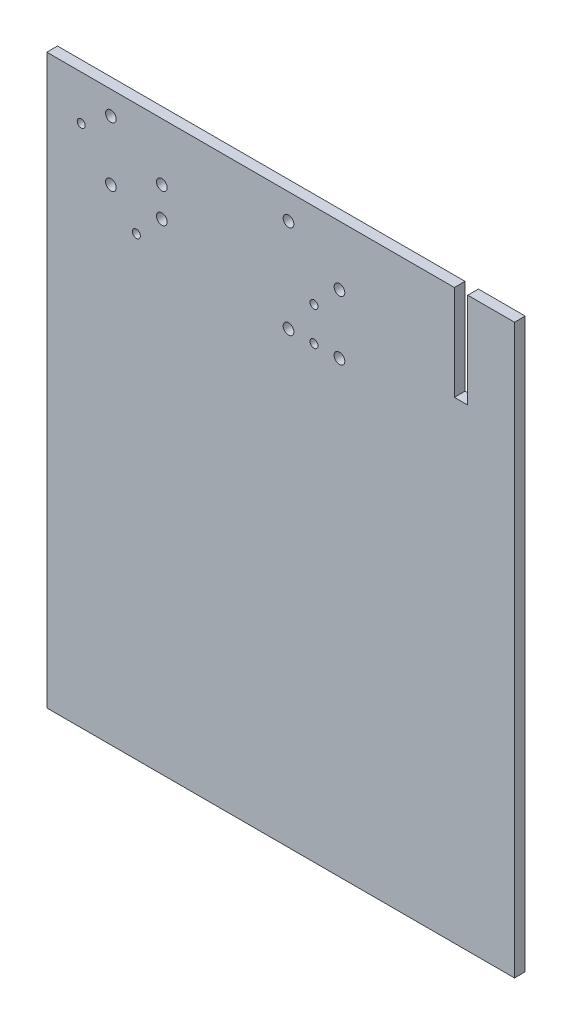
ISO-10303-21;
HEADER;
FILE_DESCRIPTION(('STEP AP214'),'2;1');
FILE_NAME('part.step','',(''),(''),'','','');
FILE_SCHEMA(('AUTOMOTIVE_DESIGN { 1 0 10303 214 1 1 1 1 }'));
ENDSEC;
DATA;
#1=APPLICATION_CONTEXT('core data for automotive mechanical design processes');
#2=APPLICATION_PROTOCOL_DEFINITION('international standard','automotive_design',2000,#1);
#3=PRODUCT_CONTEXT('',#1,'mechanical');
#4=PRODUCT('Part','Part','',(#3));
#5=PRODUCT_RELATED_PRODUCT_CATEGORY('part','',(#4));
#6=PRODUCT_DEFINITION_FORMATION('','',#4);
#7=PRODUCT_DEFINITION_CONTEXT('part definition',#1,'design');
#8=PRODUCT_DEFINITION('design','',#6,#7);
#9=PRODUCT_DEFINITION_SHAPE('','',#8);
#10=(LENGTH_UNIT() NAMED_UNIT(*) SI_UNIT(.MILLI.,.METRE.));
#11=(NAMED_UNIT(*) PLANE_ANGLE_UNIT() SI_UNIT($,.RADIAN.));
#12=(NAMED_UNIT(*) SI_UNIT($,.STERADIAN.) SOLID_ANGLE_UNIT());
#13=UNCERTAINTY_MEASURE_WITH_UNIT(LENGTH_MEASURE(1.E-05),#10,'distance_accuracy_value','');
#14=(GEOMETRIC_REPRESENTATION_CONTEXT(3) GLOBAL_UNCERTAINTY_ASSIGNED_CONTEXT((#13)) GLOBAL_UNIT_ASSIGNED_CONTEXT((#10,
#11,#12)) REPRESENTATION_CONTEXT('',''));
#15=CARTESIAN_POINT('',(0.,0.,0.));
#16=DIRECTION('',(0.,0.,1.));
#17=DIRECTION('',(1.,0.,0.));
#18=AXIS2_PLACEMENT_3D('',#15,#16,#17);
#19=CARTESIAN_POINT('',(28.,42.5,1.6));
#20=DIRECTION('',(0.,-1.,0.));
#21=DIRECTION('',(0.,0.,-1.));
#22=AXIS2_PLACEMENT_3D('',#19,#20,#21);
#23=PLANE('',#22);
#24=DIRECTION('',(-1.,0.,0.));
#25=VECTOR('',#24,1.);
#26=CARTESIAN_POINT('',(28.,42.5,0.));
#27=LINE('',#26,#25);
#28=CARTESIAN_POINT('',(35.,42.5,0.));
#29=VERTEX_POINT('',#28);
#30=CARTESIAN_POINT('',(28.,42.5,0.));
#31=VERTEX_POINT('',#30);
#32=EDGE_CURVE('E142',#29,#31,#27,.T.);
#33=ORIENTED_EDGE('',*,*,#32,.T.);
#34=DIRECTION('',(0.,0.,-1.));
#35=VECTOR('',#34,1.);
#36=CARTESIAN_POINT('',(28.,42.5,1.6));
#37=LINE('',#36,#35);
#38=CARTESIAN_POINT('',(28.,42.5,1.6));
#39=VERTEX_POINT('',#38);
#40=EDGE_CURVE('E11',#39,#31,#37,.T.);
#41=ORIENTED_EDGE('',*,*,#40,.F.);
#42=DIRECTION('',(-1.,0.,0.));
#43=VECTOR('',#42,1.);
#44=CARTESIAN_POINT('',(28.,42.5,1.6));
#45=LINE('',#44,#43);
#46=CARTESIAN_POINT('',(35.,42.5,1.6));
#47=VERTEX_POINT('',#46);
#48=EDGE_CURVE('E165',#47,#39,#45,.T.);
#49=ORIENTED_EDGE('',*,*,#48,.F.);
#50=DIRECTION('',(0.,0.,-1.));
#51=VECTOR('',#50,1.);
#52=CARTESIAN_POINT('',(35.,42.5,1.6));
#53=LINE('',#52,#51);
#54=EDGE_CURVE('E138',#47,#29,#53,.T.);
#55=ORIENTED_EDGE('',*,*,#54,.T.);
#56=EDGE_LOOP('',(#33,#41,#49,#55));
#57=FACE_BOUND('',#56,.T.);
#58=ADVANCED_FACE('F41',(#57),#23,.F.);
#59=CARTESIAN_POINT('',(28.,42.5,1.6));
#60=DIRECTION('',(1.,0.,0.));
#61=DIRECTION('',(0.,1.,0.));
#62=AXIS2_PLACEMENT_3D('',#59,#60,#61);
#63=PLANE('',#62);
#64=DIRECTION('',(0.,-1.,0.));
#65=VECTOR('',#64,1.);
#66=CARTESIAN_POINT('',(28.,42.5,0.));
#67=LINE('',#66,#65);
#68=CARTESIAN_POINT('',(28.,28.26,0.));
#69=VERTEX_POINT('',#68);
#70=EDGE_CURVE('E146',#31,#69,#67,.T.);
#71=ORIENTED_EDGE('',*,*,#70,.T.);
#72=DIRECTION('',(0.,0.,-1.));
#73=VECTOR('',#72,1.);
#74=CARTESIAN_POINT('',(28.,28.26,1.6));
#75=LINE('',#74,#73);
#76=CARTESIAN_POINT('',(28.,28.26,1.6));
#77=VERTEX_POINT('',#76);
#78=EDGE_CURVE('E50',#77,#69,#75,.T.);
#79=ORIENTED_EDGE('',*,*,#78,.F.);
#80=DIRECTION('',(0.,-1.,0.));
#81=VECTOR('',#80,1.);
#82=CARTESIAN_POINT('',(28.,42.5,1.6));
#83=LINE('',#82,#81);
#84=EDGE_CURVE('E101',#39,#77,#83,.T.);
#85=ORIENTED_EDGE('',*,*,#84,.F.);
#86=ORIENTED_EDGE('',*,*,#40,.T.);
#87=EDGE_LOOP('',(#71,#79,#85,#86));
#88=FACE_BOUND('',#87,.T.);
#89=ADVANCED_FACE('F342',(#88),#63,.F.);
#90=CARTESIAN_POINT('',(28.,28.26,1.6));
#91=DIRECTION('',(0.,-1.,0.));
#92=DIRECTION('',(1.,0.,0.));
#93=AXIS2_PLACEMENT_3D('',#90,#91,#92);
#94=PLANE('',#93);
#95=DIRECTION('',(-1.,0.,0.));
#96=VECTOR('',#95,1.);
#97=CARTESIAN_POINT('',(28.,28.26,0.));
#98=LINE('',#97,#96);
#99=CARTESIAN_POINT('',(26.,28.26,0.));
#100=VERTEX_POINT('',#99);
#101=EDGE_CURVE('E150',#69,#100,#98,.T.);
#102=ORIENTED_EDGE('',*,*,#101,.T.);
#103=DIRECTION('',(0.,0.,-1.));
#104=VECTOR('',#103,1.);
#105=CARTESIAN_POINT('',(26.,28.26,1.6));
#106=LINE('',#105,#104);
#107=CARTESIAN_POINT('',(26.,28.26,1.6));
#108=VERTEX_POINT('',#107);
#109=EDGE_CURVE('E176',#108,#100,#106,.T.);
#110=ORIENTED_EDGE('',*,*,#109,.F.);
#111=DIRECTION('',(-1.,0.,0.));
#112=VECTOR('',#111,1.);
#113=CARTESIAN_POINT('',(28.,28.26,1.6));
#114=LINE('',#113,#112);
#115=EDGE_CURVE('E186',#77,#108,#114,.T.);
#116=ORIENTED_EDGE('',*,*,#115,.F.);
#117=ORIENTED_EDGE('',*,*,#78,.T.);
#118=EDGE_LOOP('',(#102,#110,#116,#117));
#119=FACE_BOUND('',#118,.T.);
#120=ADVANCED_FACE('F184',(#119),#94,.F.);
#121=CARTESIAN_POINT('',(26.,28.26,1.6));
#122=DIRECTION('',(-1.,0.,0.));
#123=DIRECTION('',(0.,0.,1.));
#124=AXIS2_PLACEMENT_3D('',#121,#122,#123);
#125=PLANE('',#124);
#126=DIRECTION('',(0.,1.,0.));
#127=VECTOR('',#126,1.);
#128=CARTESIAN_POINT('',(26.,28.26,0.));
#129=LINE('',#128,#127);
#130=CARTESIAN_POINT('',(26.,42.5,0.));
#131=VERTEX_POINT('',#130);
#132=EDGE_CURVE('E153',#100,#131,#129,.T.);
#133=ORIENTED_EDGE('',*,*,#132,.T.);
#134=DIRECTION('',(0.,0.,-1.));
#135=VECTOR('',#134,1.);
#136=CARTESIAN_POINT('',(26.,42.5,1.6));
#137=LINE('',#136,#135);
#138=CARTESIAN_POINT('',(26.,42.5,1.6));
#139=VERTEX_POINT('',#138);
#140=EDGE_CURVE('E172',#139,#131,#137,.T.);
#141=ORIENTED_EDGE('',*,*,#140,.F.);
#142=DIRECTION('',(0.,1.,0.));
#143=VECTOR('',#142,1.);
#144=CARTESIAN_POINT('',(26.,28.26,1.6));
#145=LINE('',#144,#143);
#146=EDGE_CURVE('E199',#108,#139,#145,.T.);
#147=ORIENTED_EDGE('',*,*,#146,.F.);
#148=ORIENTED_EDGE('',*,*,#109,.T.);
#149=EDGE_LOOP('',(#133,#141,#147,#148));
#150=FACE_BOUND('',#149,.T.);
#151=ADVANCED_FACE('F194',(#150),#125,.F.);
#152=CARTESIAN_POINT('',(-35.,42.5,1.6));
#153=DIRECTION('',(0.,-1.,0.));
#154=DIRECTION('',(0.,0.,-1.));
#155=AXIS2_PLACEMENT_3D('',#152,#153,#154);
#156=PLANE('',#155);
#157=DIRECTION('',(-1.,0.,0.));
#158=VECTOR('',#157,1.);
#159=CARTESIAN_POINT('',(-35.,42.5,0.));
#160=LINE('',#159,#158);
#161=CARTESIAN_POINT('',(-35.,42.5,0.));
#162=VERTEX_POINT('',#161);
#163=EDGE_CURVE('E156',#131,#162,#160,.T.);
#164=ORIENTED_EDGE('',*,*,#163,.T.);
#165=DIRECTION('',(0.,0.,-1.));
#166=VECTOR('',#165,1.);
#167=CARTESIAN_POINT('',(-35.,42.5,1.6));
#168=LINE('',#167,#166);
#169=CARTESIAN_POINT('',(-35.,42.5,1.6));
#170=VERTEX_POINT('',#169);
#171=EDGE_CURVE('E131',#170,#162,#168,.T.);
#172=ORIENTED_EDGE('',*,*,#171,.F.);
#173=DIRECTION('',(-1.,0.,0.));
#174=VECTOR('',#173,1.);
#175=CARTESIAN_POINT('',(-35.,42.5,1.6));
#176=LINE('',#175,#174);
#177=EDGE_CURVE('E120',#139,#170,#176,.T.);
#178=ORIENTED_EDGE('',*,*,#177,.F.);
#179=ORIENTED_EDGE('',*,*,#140,.T.);
#180=EDGE_LOOP('',(#164,#172,#178,#179));
#181=FACE_BOUND('',#180,.T.);
#182=ADVANCED_FACE('F197',(#181),#156,.F.);
#183=CARTESIAN_POINT('',(-35.,-42.5,1.6));
#184=DIRECTION('',(1.,0.,0.));
#185=DIRECTION('',(0.,0.,-1.));
#186=AXIS2_PLACEMENT_3D('',#183,#184,#185);
#187=PLANE('',#186);
#188=DIRECTION('',(0.,-1.,0.));
#189=VECTOR('',#188,1.);
#190=CARTESIAN_POINT('',(-35.,-42.5,0.));
#191=LINE('',#190,#189);
#192=CARTESIAN_POINT('',(-35.,-42.5,0.));
#193=VERTEX_POINT('',#192);
#194=EDGE_CURVE('E129',#162,#193,#191,.T.);
#195=ORIENTED_EDGE('',*,*,#194,.T.);
#196=DIRECTION('',(0.,0.,-1.));
#197=VECTOR('',#196,1.);
#198=CARTESIAN_POINT('',(-35.,-42.5,1.6));
#199=LINE('',#198,#197);
#200=CARTESIAN_POINT('',(-35.,-42.5,1.6));
#201=VERTEX_POINT('',#200);
#202=EDGE_CURVE('E126',#201,#193,#199,.T.);
#203=ORIENTED_EDGE('',*,*,#202,.F.);
#204=DIRECTION('',(0.,-1.,0.));
#205=VECTOR('',#204,1.);
#206=CARTESIAN_POINT('',(-35.,-42.5,1.6));
#207=LINE('',#206,#205);
#208=EDGE_CURVE('E114',#170,#201,#207,.T.);
#209=ORIENTED_EDGE('',*,*,#208,.F.);
#210=ORIENTED_EDGE('',*,*,#171,.T.);
#211=EDGE_LOOP('',(#195,#203,#209,#210));
#212=FACE_BOUND('',#211,.T.);
#213=ADVANCED_FACE('F127',(#212),#187,.F.);
#214=CARTESIAN_POINT('',(-35.,-42.5,1.6));
#215=DIRECTION('',(0.,1.,0.));
#216=DIRECTION('',(0.,0.,1.));
#217=AXIS2_PLACEMENT_3D('',#214,#215,#216);
#218=PLANE('',#217);
#219=DIRECTION('',(1.,0.,0.));
#220=VECTOR('',#219,1.);
#221=CARTESIAN_POINT('',(-35.,-42.5,0.));
#222=LINE('',#221,#220);
#223=CARTESIAN_POINT('',(35.,-42.5,0.));
#224=VERTEX_POINT('',#223);
#225=EDGE_CURVE('E87',#193,#224,#222,.T.);
#226=ORIENTED_EDGE('',*,*,#225,.T.);
#227=DIRECTION('',(0.,0.,-1.));
#228=VECTOR('',#227,1.);
#229=CARTESIAN_POINT('',(35.,-42.5,1.6));
#230=LINE('',#229,#228);
#231=CARTESIAN_POINT('',(35.,-42.5,1.6));
#232=VERTEX_POINT('',#231);
#233=EDGE_CURVE('E132',#232,#224,#230,.T.);
#234=ORIENTED_EDGE('',*,*,#233,.F.);
#235=DIRECTION('',(1.,0.,0.));
#236=VECTOR('',#235,1.);
#237=CARTESIAN_POINT('',(-35.,-42.5,1.6));
#238=LINE('',#237,#236);
#239=EDGE_CURVE('E118',#201,#232,#238,.T.);
#240=ORIENTED_EDGE('',*,*,#239,.F.);
#241=ORIENTED_EDGE('',*,*,#202,.T.);
#242=EDGE_LOOP('',(#226,#234,#240,#241));
#243=FACE_BOUND('',#242,.T.);
#244=ADVANCED_FACE('F134',(#243),#218,.F.);
#245=CARTESIAN_POINT('',(35.,-42.5,1.6));
#246=DIRECTION('',(-1.,0.,0.));
#247=DIRECTION('',(0.,0.,1.));
#248=AXIS2_PLACEMENT_3D('',#245,#246,#247);
#249=PLANE('',#248);
#250=DIRECTION('',(0.,1.,0.));
#251=VECTOR('',#250,1.);
#252=CARTESIAN_POINT('',(35.,-42.5,0.));
#253=LINE('',#252,#251);
#254=EDGE_CURVE('E93',#224,#29,#253,.T.);
#255=ORIENTED_EDGE('',*,*,#254,.T.);
#256=ORIENTED_EDGE('',*,*,#54,.F.);
#257=DIRECTION('',(0.,1.,0.));
#258=VECTOR('',#257,1.);
#259=CARTESIAN_POINT('',(35.,-42.5,1.6));
#260=LINE('',#259,#258);
#261=EDGE_CURVE('E58',#232,#47,#260,.T.);
#262=ORIENTED_EDGE('',*,*,#261,.F.);
#263=ORIENTED_EDGE('',*,*,#233,.T.);
#264=EDGE_LOOP('',(#255,#256,#262,#263));
#265=FACE_BOUND('',#264,.T.);
#266=ADVANCED_FACE('F317',(#265),#249,.F.);
#267=CARTESIAN_POINT('',(0.,0.,1.6));
#268=DIRECTION('',(0.,0.,1.));
#269=DIRECTION('',(1.,0.,0.));
#270=AXIS2_PLACEMENT_3D('',#267,#268,#269);
#271=PLANE('',#270);
#272=CARTESIAN_POINT('',(-29.8453411553624,35.8394967738393,1.6));
#273=DIRECTION('',(0.,0.,1.));
#274=DIRECTION('',(1.,0.,0.));
#275=AXIS2_PLACEMENT_3D('',#272,#273,#274);
#276=CIRCLE('',#275,0.600000000000001);
#277=CARTESIAN_POINT('',(-29.2453411553624,35.8394967738393,1.6));
#278=VERTEX_POINT('',#277);
#279=EDGE_CURVE('E258',#278,#278,#276,.T.);
#280=ORIENTED_EDGE('',*,*,#279,.F.);
#281=EDGE_LOOP('',(#280));
#282=FACE_BOUND('',#281,.T.);
#283=CARTESIAN_POINT('',(4.98804487002071,24.7194139512987,1.6));
#284=DIRECTION('',(0.,0.,1.));
#285=DIRECTION('',(1.,0.,0.));
#286=AXIS2_PLACEMENT_3D('',#283,#284,#285);
#287=CIRCLE('',#286,0.6);
#288=CARTESIAN_POINT('',(5.58804487002071,24.7194139512987,1.6));
#289=VERTEX_POINT('',#288);
#290=EDGE_CURVE('E249',#289,#289,#287,.T.);
#291=ORIENTED_EDGE('',*,*,#290,.F.);
#292=EDGE_LOOP('',(#291));
#293=FACE_BOUND('',#292,.T.);
#294=CARTESIAN_POINT('',(8.79804487002071,24.7194139512987,1.6));
#295=DIRECTION('',(0.,0.,1.));
#296=DIRECTION('',(1.,0.,0.));
#297=AXIS2_PLACEMENT_3D('',#294,#295,#296);
#298=CIRCLE('',#297,0.8);
#299=CARTESIAN_POINT('',(9.59804487002071,24.7194139512987,1.6));
#300=VERTEX_POINT('',#299);
#301=EDGE_CURVE('E274',#300,#300,#298,.T.);
#302=ORIENTED_EDGE('',*,*,#301,.F.);
#303=EDGE_LOOP('',(#302));
#304=FACE_BOUND('',#303,.T.);
#305=CARTESIAN_POINT('',(1.17804487002071,24.7194139512987,1.6));
#306=DIRECTION('',(0.,0.,1.));
#307=DIRECTION('',(1.,0.,0.));
#308=AXIS2_PLACEMENT_3D('',#305,#306,#307);
#309=CIRCLE('',#308,0.799999999999999);
#310=CARTESIAN_POINT('',(1.97804487002071,24.7194139512987,1.6));
#311=VERTEX_POINT('',#310);
#312=EDGE_CURVE('E265',#311,#311,#309,.T.);
#313=ORIENTED_EDGE('',*,*,#312,.F.);
#314=EDGE_LOOP('',(#313));
#315=FACE_BOUND('',#314,.T.);
#316=CARTESIAN_POINT('',(-25.4053411553624,39.0094967738393,1.6));
#317=DIRECTION('',(0.,0.,1.));
#318=DIRECTION('',(1.,0.,0.));
#319=AXIS2_PLACEMENT_3D('',#316,#317,#318);
#320=CIRCLE('',#319,0.8);
#321=CARTESIAN_POINT('',(-24.6053411553624,39.0094967738393,1.6));
#322=VERTEX_POINT('',#321);
#323=EDGE_CURVE('E217',#322,#322,#320,.T.);
#324=ORIENTED_EDGE('',*,*,#323,.F.);
#325=EDGE_LOOP('',(#324));
#326=FACE_BOUND('',#325,.T.);
#327=CARTESIAN_POINT('',(-17.7853411553624,33.9294967738393,1.6));
#328=DIRECTION('',(0.,0.,1.));
#329=DIRECTION('',(1.,0.,0.));
#330=AXIS2_PLACEMENT_3D('',#327,#328,#329);
#331=CIRCLE('',#330,0.8);
#332=CARTESIAN_POINT('',(-16.9853411553624,33.9294967738393,1.6));
#333=VERTEX_POINT('',#332);
#334=EDGE_CURVE('E226',#333,#333,#331,.T.);
#335=ORIENTED_EDGE('',*,*,#334,.F.);
#336=EDGE_LOOP('',(#335));
#337=FACE_BOUND('',#336,.T.);
#338=CARTESIAN_POINT('',(-25.4053411553624,30.1194967738393,1.6));
#339=DIRECTION('',(0.,0.,1.));
#340=DIRECTION('',(1.,0.,0.));
#341=AXIS2_PLACEMENT_3D('',#338,#339,#340);
#342=CIRCLE('',#341,0.799999999999999);
#343=CARTESIAN_POINT('',(-24.6053411553624,30.1194967738393,1.6));
#344=VERTEX_POINT('',#343);
#345=EDGE_CURVE('E234',#344,#344,#342,.T.);
#346=ORIENTED_EDGE('',*,*,#345,.F.);
#347=EDGE_LOOP('',(#346));
#348=FACE_BOUND('',#347,.T.);
#349=CARTESIAN_POINT('',(-17.7853411553624,29.4844967738393,1.6));
#350=DIRECTION('',(0.,0.,1.));
#351=DIRECTION('',(1.,0.,0.));
#352=AXIS2_PLACEMENT_3D('',#349,#350,#351);
#353=CIRCLE('',#352,0.799999999999999);
#354=CARTESIAN_POINT('',(-16.9853411553624,29.4844967738393,1.6));
#355=VERTEX_POINT('',#354);
#356=EDGE_CURVE('E242',#355,#355,#353,.T.);
#357=ORIENTED_EDGE('',*,*,#356,.F.);
#358=EDGE_LOOP('',(#357));
#359=FACE_BOUND('',#358,.T.);
#360=CARTESIAN_POINT('',(4.98804487002071,29.7994139512987,1.6));
#361=DIRECTION('',(0.,0.,1.));
#362=DIRECTION('',(1.,0.,0.));
#363=AXIS2_PLACEMENT_3D('',#360,#361,#362);
#364=CIRCLE('',#363,0.6);
#365=CARTESIAN_POINT('',(5.58804487002071,29.7994139512987,1.6));
#366=VERTEX_POINT('',#365);
#367=EDGE_CURVE('E297',#366,#366,#364,.T.);
#368=ORIENTED_EDGE('',*,*,#367,.F.);
#369=EDGE_LOOP('',(#368));
#370=FACE_BOUND('',#369,.T.);
#371=CARTESIAN_POINT('',(8.79804487002071,33.6094139512987,1.6));
#372=DIRECTION('',(0.,0.,1.));
#373=DIRECTION('',(1.,0.,0.));
#374=AXIS2_PLACEMENT_3D('',#371,#372,#373);
#375=CIRCLE('',#374,0.800000000000003);
#376=CARTESIAN_POINT('',(9.59804487002071,33.6094139512987,1.6));
#377=VERTEX_POINT('',#376);
#378=EDGE_CURVE('E289',#377,#377,#375,.T.);
#379=ORIENTED_EDGE('',*,*,#378,.F.);
#380=EDGE_LOOP('',(#379));
#381=FACE_BOUND('',#380,.T.);
#382=CARTESIAN_POINT('',(1.17804487002071,38.6894139512987,1.6));
#383=DIRECTION('',(0.,0.,1.));
#384=DIRECTION('',(1.,0.,0.));
#385=AXIS2_PLACEMENT_3D('',#382,#383,#384);
#386=CIRCLE('',#385,0.800000000000001);
#387=CARTESIAN_POINT('',(1.97804487002071,38.6894139512987,1.6));
#388=VERTEX_POINT('',#387);
#389=EDGE_CURVE('E281',#388,#388,#386,.T.);
#390=ORIENTED_EDGE('',*,*,#389,.F.);
#391=EDGE_LOOP('',(#390));
#392=FACE_BOUND('',#391,.T.);
#393=CARTESIAN_POINT('',(-21.5953411553624,25.6694967738393,1.6));
#394=DIRECTION('',(0.,0.,1.));
#395=DIRECTION('',(1.,0.,0.));
#396=AXIS2_PLACEMENT_3D('',#393,#394,#395);
#397=CIRCLE('',#396,0.6);
#398=CARTESIAN_POINT('',(-20.9953411553624,25.6694967738393,1.6));
#399=VERTEX_POINT('',#398);
#400=EDGE_CURVE('E209',#399,#399,#397,.T.);
#401=ORIENTED_EDGE('',*,*,#400,.F.);
#402=EDGE_LOOP('',(#401));
#403=FACE_BOUND('',#402,.T.);
#404=ORIENTED_EDGE('',*,*,#48,.T.);
#405=ORIENTED_EDGE('',*,*,#84,.T.);
#406=ORIENTED_EDGE('',*,*,#115,.T.);
#407=ORIENTED_EDGE('',*,*,#146,.T.);
#408=ORIENTED_EDGE('',*,*,#177,.T.);
#409=ORIENTED_EDGE('',*,*,#208,.T.);
#410=ORIENTED_EDGE('',*,*,#239,.T.);
#411=ORIENTED_EDGE('',*,*,#261,.T.);
#412=EDGE_LOOP('',(#404,#405,#406,#407,#408,#409,#410,#411));
#413=FACE_BOUND('',#412,.T.);
#414=ADVANCED_FACE('F116',(#282,#293,#304,#315,#326,#337,#348,#359,#370,#381,#392,#403,#413),
#271,.T.);
#415=CARTESIAN_POINT('',(0.,0.,0.));
#416=DIRECTION('',(0.,0.,1.));
#417=DIRECTION('',(1.,0.,0.));
#418=AXIS2_PLACEMENT_3D('',#415,#416,#417);
#419=PLANE('',#418);
#420=CARTESIAN_POINT('',(-29.8453411553624,35.8394967738393,0.));
#421=DIRECTION('',(0.,0.,1.));
#422=DIRECTION('',(1.,0.,0.));
#423=AXIS2_PLACEMENT_3D('',#420,#421,#422);
#424=CIRCLE('',#423,0.600000000000001);
#425=CARTESIAN_POINT('',(-29.2453411553624,35.8394967738393,0.));
#426=VERTEX_POINT('',#425);
#427=EDGE_CURVE('E222',#426,#426,#424,.T.);
#428=ORIENTED_EDGE('',*,*,#427,.T.);
#429=EDGE_LOOP('',(#428));
#430=FACE_BOUND('',#429,.T.);
#431=CARTESIAN_POINT('',(4.98804487002071,24.7194139512987,0.));
#432=DIRECTION('',(0.,0.,1.));
#433=DIRECTION('',(1.,0.,0.));
#434=AXIS2_PLACEMENT_3D('',#431,#432,#433);
#435=CIRCLE('',#434,0.6);
#436=CARTESIAN_POINT('',(5.58804487002071,24.7194139512987,0.));
#437=VERTEX_POINT('',#436);
#438=EDGE_CURVE('E253',#437,#437,#435,.T.);
#439=ORIENTED_EDGE('',*,*,#438,.T.);
#440=EDGE_LOOP('',(#439));
#441=FACE_BOUND('',#440,.T.);
#442=CARTESIAN_POINT('',(8.79804487002071,24.7194139512987,0.));
#443=DIRECTION('',(0.,0.,1.));
#444=DIRECTION('',(1.,0.,0.));
#445=AXIS2_PLACEMENT_3D('',#442,#443,#444);
#446=CIRCLE('',#445,0.8);
#447=CARTESIAN_POINT('',(9.59804487002071,24.7194139512987,0.));
#448=VERTEX_POINT('',#447);
#449=EDGE_CURVE('E254',#448,#448,#446,.T.);
#450=ORIENTED_EDGE('',*,*,#449,.T.);
#451=EDGE_LOOP('',(#450));
#452=FACE_BOUND('',#451,.T.);
#453=CARTESIAN_POINT('',(1.17804487002071,24.7194139512987,0.));
#454=DIRECTION('',(0.,0.,1.));
#455=DIRECTION('',(1.,0.,0.));
#456=AXIS2_PLACEMENT_3D('',#453,#454,#455);
#457=CIRCLE('',#456,0.799999999999999);
#458=CARTESIAN_POINT('',(1.97804487002071,24.7194139512987,0.));
#459=VERTEX_POINT('',#458);
#460=EDGE_CURVE('E269',#459,#459,#457,.T.);
#461=ORIENTED_EDGE('',*,*,#460,.T.);
#462=EDGE_LOOP('',(#461));
#463=FACE_BOUND('',#462,.T.);
#464=CARTESIAN_POINT('',(-25.4053411553624,39.0094967738393,0.));
#465=DIRECTION('',(0.,0.,1.));
#466=DIRECTION('',(1.,0.,0.));
#467=AXIS2_PLACEMENT_3D('',#464,#465,#466);
#468=CIRCLE('',#467,0.8);
#469=CARTESIAN_POINT('',(-24.6053411553624,39.0094967738393,0.));
#470=VERTEX_POINT('',#469);
#471=EDGE_CURVE('E221',#470,#470,#468,.T.);
#472=ORIENTED_EDGE('',*,*,#471,.T.);
#473=EDGE_LOOP('',(#472));
#474=FACE_BOUND('',#473,.T.);
#475=CARTESIAN_POINT('',(-17.7853411553624,33.9294967738393,0.));
#476=DIRECTION('',(0.,0.,1.));
#477=DIRECTION('',(1.,0.,0.));
#478=AXIS2_PLACEMENT_3D('',#475,#476,#477);
#479=CIRCLE('',#478,0.8);
#480=CARTESIAN_POINT('',(-16.9853411553624,33.9294967738393,0.));
#481=VERTEX_POINT('',#480);
#482=EDGE_CURVE('E230',#481,#481,#479,.T.);
#483=ORIENTED_EDGE('',*,*,#482,.T.);
#484=EDGE_LOOP('',(#483));
#485=FACE_BOUND('',#484,.T.);
#486=CARTESIAN_POINT('',(-25.4053411553624,30.1194967738393,0.));
#487=DIRECTION('',(0.,0.,1.));
#488=DIRECTION('',(1.,0.,0.));
#489=AXIS2_PLACEMENT_3D('',#486,#487,#488);
#490=CIRCLE('',#489,0.799999999999999);
#491=CARTESIAN_POINT('',(-24.6053411553624,30.1194967738393,0.));
#492=VERTEX_POINT('',#491);
#493=EDGE_CURVE('E238',#492,#492,#490,.T.);
#494=ORIENTED_EDGE('',*,*,#493,.T.);
#495=EDGE_LOOP('',(#494));
#496=FACE_BOUND('',#495,.T.);
#497=CARTESIAN_POINT('',(-17.7853411553624,29.4844967738393,0.));
#498=DIRECTION('',(0.,0.,1.));
#499=DIRECTION('',(1.,0.,0.));
#500=AXIS2_PLACEMENT_3D('',#497,#498,#499);
#501=CIRCLE('',#500,0.799999999999999);
#502=CARTESIAN_POINT('',(-16.9853411553624,29.4844967738393,0.));
#503=VERTEX_POINT('',#502);
#504=EDGE_CURVE('E213',#503,#503,#501,.T.);
#505=ORIENTED_EDGE('',*,*,#504,.T.);
#506=EDGE_LOOP('',(#505));
#507=FACE_BOUND('',#506,.T.);
#508=CARTESIAN_POINT('',(4.98804487002071,29.7994139512987,0.));
#509=DIRECTION('',(0.,0.,1.));
#510=DIRECTION('',(1.,0.,0.));
#511=AXIS2_PLACEMENT_3D('',#508,#509,#510);
#512=CIRCLE('',#511,0.6);
#513=CARTESIAN_POINT('',(5.58804487002071,29.7994139512987,0.));
#514=VERTEX_POINT('',#513);
#515=EDGE_CURVE('E270',#514,#514,#512,.T.);
#516=ORIENTED_EDGE('',*,*,#515,.T.);
#517=EDGE_LOOP('',(#516));
#518=FACE_BOUND('',#517,.T.);
#519=CARTESIAN_POINT('',(8.79804487002071,33.6094139512987,0.));
#520=DIRECTION('',(0.,0.,1.));
#521=DIRECTION('',(1.,0.,0.));
#522=AXIS2_PLACEMENT_3D('',#519,#520,#521);
#523=CIRCLE('',#522,0.800000000000003);
#524=CARTESIAN_POINT('',(9.59804487002071,33.6094139512987,0.));
#525=VERTEX_POINT('',#524);
#526=EDGE_CURVE('E293',#525,#525,#523,.T.);
#527=ORIENTED_EDGE('',*,*,#526,.T.);
#528=EDGE_LOOP('',(#527));
#529=FACE_BOUND('',#528,.T.);
#530=CARTESIAN_POINT('',(1.17804487002071,38.6894139512987,0.));
#531=DIRECTION('',(0.,0.,1.));
#532=DIRECTION('',(1.,0.,0.));
#533=AXIS2_PLACEMENT_3D('',#530,#531,#532);
#534=CIRCLE('',#533,0.800000000000001);
#535=CARTESIAN_POINT('',(1.97804487002071,38.6894139512987,0.));
#536=VERTEX_POINT('',#535);
#537=EDGE_CURVE('E285',#536,#536,#534,.T.);
#538=ORIENTED_EDGE('',*,*,#537,.T.);
#539=EDGE_LOOP('',(#538));
#540=FACE_BOUND('',#539,.T.);
#541=CARTESIAN_POINT('',(-21.5953411553624,25.6694967738393,0.));
#542=DIRECTION('',(0.,0.,1.));
#543=DIRECTION('',(1.,0.,0.));
#544=AXIS2_PLACEMENT_3D('',#541,#542,#543);
#545=CIRCLE('',#544,0.6);
#546=CARTESIAN_POINT('',(-20.9953411553624,25.6694967738393,0.));
#547=VERTEX_POINT('',#546);
#548=EDGE_CURVE('E147',#547,#547,#545,.T.);
#549=ORIENTED_EDGE('',*,*,#548,.T.);
#550=EDGE_LOOP('',(#549));
#551=FACE_BOUND('',#550,.T.);
#552=ORIENTED_EDGE('',*,*,#32,.F.);
#553=ORIENTED_EDGE('',*,*,#254,.F.);
#554=ORIENTED_EDGE('',*,*,#225,.F.);
#555=ORIENTED_EDGE('',*,*,#194,.F.);
#556=ORIENTED_EDGE('',*,*,#163,.F.);
#557=ORIENTED_EDGE('',*,*,#132,.F.);
#558=ORIENTED_EDGE('',*,*,#101,.F.);
#559=ORIENTED_EDGE('',*,*,#70,.F.);
#560=EDGE_LOOP('',(#552,#553,#554,#555,#556,#557,#558,#559));
#561=FACE_BOUND('',#560,.T.);
#562=ADVANCED_FACE('F190',(#430,#441,#452,#463,#474,#485,#496,#507,#518,#529,#540,#551,#561),
#419,.F.);
#563=CARTESIAN_POINT('',(-21.5953411553624,25.6694967738393,0.));
#564=DIRECTION('',(0.,0.,1.));
#565=DIRECTION('',(1.,0.,0.));
#566=AXIS2_PLACEMENT_3D('',#563,#564,#565);
#567=CYLINDRICAL_SURFACE('',#566,0.6);
#568=ORIENTED_EDGE('',*,*,#548,.F.);
#569=EDGE_LOOP('',(#568));
#570=FACE_BOUND('',#569,.T.);
#571=ORIENTED_EDGE('',*,*,#400,.T.);
#572=EDGE_LOOP('',(#571));
#573=FACE_BOUND('',#572,.T.);
#574=ADVANCED_FACE('F326',(#570,#573),#567,.F.);
#575=CARTESIAN_POINT('',(1.17804487002071,38.6894139512987,0.));
#576=DIRECTION('',(0.,0.,1.));
#577=DIRECTION('',(1.,0.,0.));
#578=AXIS2_PLACEMENT_3D('',#575,#576,#577);
#579=CYLINDRICAL_SURFACE('',#578,0.800000000000001);
#580=ORIENTED_EDGE('',*,*,#537,.F.);
#581=EDGE_LOOP('',(#580));
#582=FACE_BOUND('',#581,.T.);
#583=ORIENTED_EDGE('',*,*,#389,.T.);
#584=EDGE_LOOP('',(#583));
#585=FACE_BOUND('',#584,.T.);
#586=ADVANCED_FACE('F328',(#582,#585),#579,.F.);
#587=CARTESIAN_POINT('',(8.79804487002071,33.6094139512987,0.));
#588=DIRECTION('',(0.,0.,1.));
#589=DIRECTION('',(1.,0.,0.));
#590=AXIS2_PLACEMENT_3D('',#587,#588,#589);
#591=CYLINDRICAL_SURFACE('',#590,0.800000000000003);
#592=ORIENTED_EDGE('',*,*,#526,.F.);
#593=EDGE_LOOP('',(#592));
#594=FACE_BOUND('',#593,.T.);
#595=ORIENTED_EDGE('',*,*,#378,.T.);
#596=EDGE_LOOP('',(#595));
#597=FACE_BOUND('',#596,.T.);
#598=ADVANCED_FACE('F311',(#594,#597),#591,.F.);
#599=CARTESIAN_POINT('',(4.98804487002071,29.7994139512987,0.));
#600=DIRECTION('',(0.,0.,1.));
#601=DIRECTION('',(1.,0.,0.));
#602=AXIS2_PLACEMENT_3D('',#599,#600,#601);
#603=CYLINDRICAL_SURFACE('',#602,0.6);
#604=ORIENTED_EDGE('',*,*,#515,.F.);
#605=EDGE_LOOP('',(#604));
#606=FACE_BOUND('',#605,.T.);
#607=ORIENTED_EDGE('',*,*,#367,.T.);
#608=EDGE_LOOP('',(#607));
#609=FACE_BOUND('',#608,.T.);
#610=ADVANCED_FACE('F307',(#606,#609),#603,.F.);
#611=CARTESIAN_POINT('',(-17.7853411553624,29.4844967738393,0.));
#612=DIRECTION('',(0.,0.,1.));
#613=DIRECTION('',(1.,0.,0.));
#614=AXIS2_PLACEMENT_3D('',#611,#612,#613);
#615=CYLINDRICAL_SURFACE('',#614,0.799999999999999);
#616=ORIENTED_EDGE('',*,*,#504,.F.);
#617=EDGE_LOOP('',(#616));
#618=FACE_BOUND('',#617,.T.);
#619=ORIENTED_EDGE('',*,*,#356,.T.);
#620=EDGE_LOOP('',(#619));
#621=FACE_BOUND('',#620,.T.);
#622=ADVANCED_FACE('F310',(#618,#621),#615,.F.);
#623=CARTESIAN_POINT('',(-25.4053411553624,30.1194967738393,0.));
#624=DIRECTION('',(0.,0.,1.));
#625=DIRECTION('',(1.,0.,0.));
#626=AXIS2_PLACEMENT_3D('',#623,#624,#625);
#627=CYLINDRICAL_SURFACE('',#626,0.799999999999999);
#628=ORIENTED_EDGE('',*,*,#493,.F.);
#629=EDGE_LOOP('',(#628));
#630=FACE_BOUND('',#629,.T.);
#631=ORIENTED_EDGE('',*,*,#345,.T.);
#632=EDGE_LOOP('',(#631));
#633=FACE_BOUND('',#632,.T.);
#634=ADVANCED_FACE('F435',(#630,#633),#627,.F.);
#635=CARTESIAN_POINT('',(-17.7853411553624,33.9294967738393,0.));
#636=DIRECTION('',(0.,0.,1.));
#637=DIRECTION('',(1.,0.,0.));
#638=AXIS2_PLACEMENT_3D('',#635,#636,#637);
#639=CYLINDRICAL_SURFACE('',#638,0.8);
#640=ORIENTED_EDGE('',*,*,#482,.F.);
#641=EDGE_LOOP('',(#640));
#642=FACE_BOUND('',#641,.T.);
#643=ORIENTED_EDGE('',*,*,#334,.T.);
#644=EDGE_LOOP('',(#643));
#645=FACE_BOUND('',#644,.T.);
#646=ADVANCED_FACE('F445',(#642,#645),#639,.F.);
#647=CARTESIAN_POINT('',(-25.4053411553624,39.0094967738393,0.));
#648=DIRECTION('',(0.,0.,1.));
#649=DIRECTION('',(1.,0.,0.));
#650=AXIS2_PLACEMENT_3D('',#647,#648,#649);
#651=CYLINDRICAL_SURFACE('',#650,0.8);
#652=ORIENTED_EDGE('',*,*,#471,.F.);
#653=EDGE_LOOP('',(#652));
#654=FACE_BOUND('',#653,.T.);
#655=ORIENTED_EDGE('',*,*,#323,.T.);
#656=EDGE_LOOP('',(#655));
#657=FACE_BOUND('',#656,.T.);
#658=ADVANCED_FACE('F455',(#654,#657),#651,.F.);
#659=CARTESIAN_POINT('',(1.17804487002071,24.7194139512987,0.));
#660=DIRECTION('',(0.,0.,1.));
#661=DIRECTION('',(1.,0.,0.));
#662=AXIS2_PLACEMENT_3D('',#659,#660,#661);
#663=CYLINDRICAL_SURFACE('',#662,0.799999999999999);
#664=ORIENTED_EDGE('',*,*,#460,.F.);
#665=EDGE_LOOP('',(#664));
#666=FACE_BOUND('',#665,.T.);
#667=ORIENTED_EDGE('',*,*,#312,.T.);
#668=EDGE_LOOP('',(#667));
#669=FACE_BOUND('',#668,.T.);
#670=ADVANCED_FACE('F465',(#666,#669),#663,.F.);
#671=CARTESIAN_POINT('',(8.79804487002071,24.7194139512987,0.));
#672=DIRECTION('',(0.,0.,1.));
#673=DIRECTION('',(1.,0.,0.));
#674=AXIS2_PLACEMENT_3D('',#671,#672,#673);
#675=CYLINDRICAL_SURFACE('',#674,0.8);
#676=ORIENTED_EDGE('',*,*,#449,.F.);
#677=EDGE_LOOP('',(#676));
#678=FACE_BOUND('',#677,.T.);
#679=ORIENTED_EDGE('',*,*,#301,.T.);
#680=EDGE_LOOP('',(#679));
#681=FACE_BOUND('',#680,.T.);
#682=ADVANCED_FACE('F474',(#678,#681),#675,.F.);
#683=CARTESIAN_POINT('',(4.98804487002071,24.7194139512987,0.));
#684=DIRECTION('',(0.,0.,1.));
#685=DIRECTION('',(1.,0.,0.));
#686=AXIS2_PLACEMENT_3D('',#683,#684,#685);
#687=CYLINDRICAL_SURFACE('',#686,0.6);
#688=ORIENTED_EDGE('',*,*,#438,.F.);
#689=EDGE_LOOP('',(#688));
#690=FACE_BOUND('',#689,.T.);
#691=ORIENTED_EDGE('',*,*,#290,.T.);
#692=EDGE_LOOP('',(#691));
#693=FACE_BOUND('',#692,.T.);
#694=ADVANCED_FACE('F484',(#690,#693),#687,.F.);
#695=CARTESIAN_POINT('',(-29.8453411553624,35.8394967738393,0.));
#696=DIRECTION('',(0.,0.,1.));
#697=DIRECTION('',(1.,0.,0.));
#698=AXIS2_PLACEMENT_3D('',#695,#696,#697);
#699=CYLINDRICAL_SURFACE('',#698,0.600000000000001);
#700=ORIENTED_EDGE('',*,*,#427,.F.);
#701=EDGE_LOOP('',(#700));
#702=FACE_BOUND('',#701,.T.);
#703=ORIENTED_EDGE('',*,*,#279,.T.);
#704=EDGE_LOOP('',(#703));
#705=FACE_BOUND('',#704,.T.);
#706=ADVANCED_FACE('F494',(#702,#705),#699,.F.);
#707=CLOSED_SHELL('',(#58,#89,#120,#151,#182,#213,#244,#266,#414,#562,#574,#586,#598,#610,#622,
#634,#646,#658,#670,#682,#694,#706));
#708=MANIFOLD_SOLID_BREP('B2',#707);
#709=ADVANCED_BREP_SHAPE_REPRESENTATION('',(#18,#708),#14);
#710=SHAPE_DEFINITION_REPRESENTATION(#9,#709);
ENDSEC;
END-ISO-10303-21;
